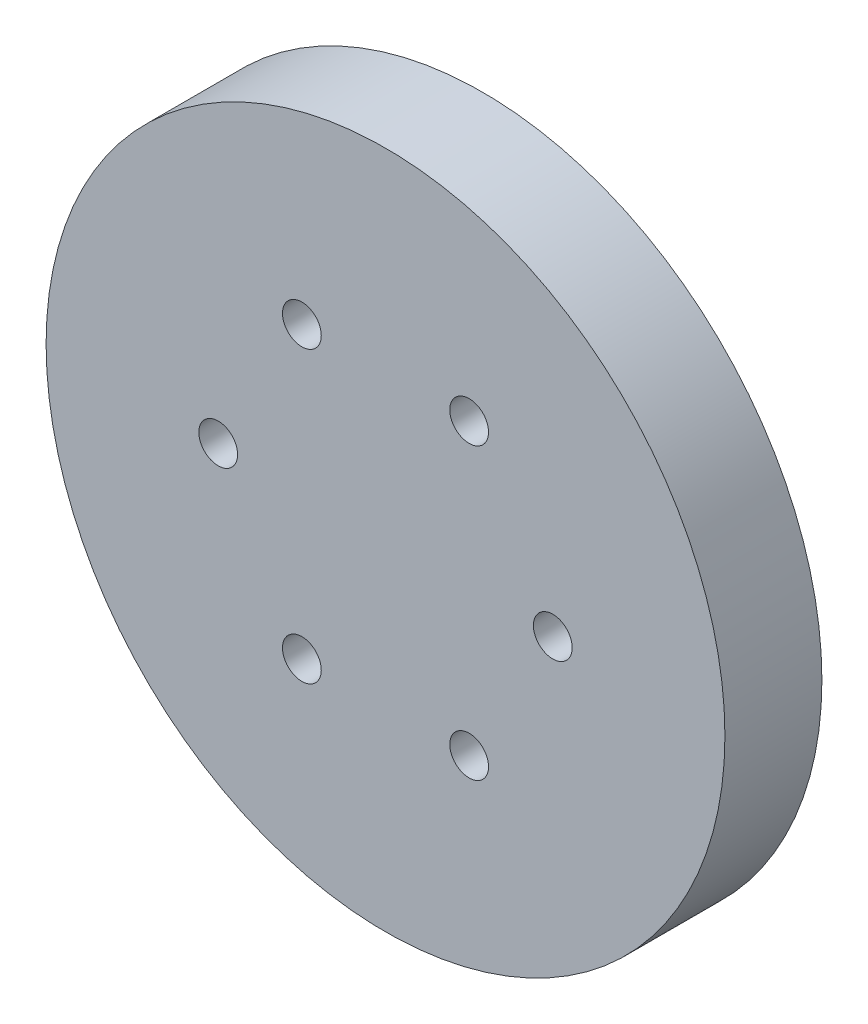
ISO-10303-21;
HEADER;
FILE_DESCRIPTION(('STEP AP214'),'2;1');
FILE_NAME('part.step','',(''),(''),'','','');
FILE_SCHEMA(('AUTOMOTIVE_DESIGN { 1 0 10303 214 1 1 1 1 }'));
ENDSEC;
DATA;
#1=APPLICATION_CONTEXT('core data for automotive mechanical design processes');
#2=APPLICATION_PROTOCOL_DEFINITION('international standard','automotive_design',2000,#1);
#3=PRODUCT_CONTEXT('',#1,'mechanical');
#4=PRODUCT('Part','Part','',(#3));
#5=PRODUCT_RELATED_PRODUCT_CATEGORY('part','',(#4));
#6=PRODUCT_DEFINITION_FORMATION('','',#4);
#7=PRODUCT_DEFINITION_CONTEXT('part definition',#1,'design');
#8=PRODUCT_DEFINITION('design','',#6,#7);
#9=PRODUCT_DEFINITION_SHAPE('','',#8);
#10=(LENGTH_UNIT() NAMED_UNIT(*) SI_UNIT(.MILLI.,.METRE.));
#11=(NAMED_UNIT(*) PLANE_ANGLE_UNIT() SI_UNIT($,.RADIAN.));
#12=(NAMED_UNIT(*) SI_UNIT($,.STERADIAN.) SOLID_ANGLE_UNIT());
#13=UNCERTAINTY_MEASURE_WITH_UNIT(LENGTH_MEASURE(1.E-05),#10,'distance_accuracy_value','');
#14=(GEOMETRIC_REPRESENTATION_CONTEXT(3) GLOBAL_UNCERTAINTY_ASSIGNED_CONTEXT((#13)) GLOBAL_UNIT_ASSIGNED_CONTEXT((#10,
#11,#12)) REPRESENTATION_CONTEXT('',''));
#15=CARTESIAN_POINT('',(0.,0.,0.));
#16=DIRECTION('',(0.,0.,1.));
#17=DIRECTION('',(1.,0.,0.));
#18=AXIS2_PLACEMENT_3D('',#15,#16,#17);
#19=CARTESIAN_POINT('',(8.62499999999986,-14.9389382152816,10.));
#20=DIRECTION('',(0.,0.,-1.));
#21=DIRECTION('',(-1.,0.,0.));
#22=AXIS2_PLACEMENT_3D('',#19,#20,#21);
#23=CYLINDRICAL_SURFACE('',#22,2.);
#24=CARTESIAN_POINT('',(8.62499999999986,-14.9389382152816,10.));
#25=DIRECTION('',(0.,0.,1.));
#26=DIRECTION('',(1.,0.,0.));
#27=AXIS2_PLACEMENT_3D('',#24,#25,#26);
#28=CIRCLE('',#27,2.);
#29=CARTESIAN_POINT('',(10.6249999999999,-14.9389382152816,10.));
#30=VERTEX_POINT('',#29);
#31=EDGE_CURVE('E47',#30,#30,#28,.T.);
#32=ORIENTED_EDGE('',*,*,#31,.T.);
#33=EDGE_LOOP('',(#32));
#34=FACE_BOUND('',#33,.T.);
#35=CARTESIAN_POINT('',(8.62499999999986,-14.9389382152816,0.));
#36=DIRECTION('',(0.,0.,1.));
#37=DIRECTION('',(1.,0.,0.));
#38=AXIS2_PLACEMENT_3D('',#35,#36,#37);
#39=CIRCLE('',#38,2.);
#40=CARTESIAN_POINT('',(10.6249999999999,-14.9389382152816,0.));
#41=VERTEX_POINT('',#40);
#42=EDGE_CURVE('E70',#41,#41,#39,.T.);
#43=ORIENTED_EDGE('',*,*,#42,.F.);
#44=EDGE_LOOP('',(#43));
#45=FACE_BOUND('',#44,.T.);
#46=ADVANCED_FACE('F39',(#34,#45),#23,.F.);
#47=CARTESIAN_POINT('',(17.25,-1.20456106190088E-13,10.));
#48=DIRECTION('',(0.,0.,-1.));
#49=DIRECTION('',(-1.,0.,0.));
#50=AXIS2_PLACEMENT_3D('',#47,#48,#49);
#51=CYLINDRICAL_SURFACE('',#50,2.);
#52=CARTESIAN_POINT('',(17.25,-1.20456106190088E-13,10.));
#53=DIRECTION('',(0.,0.,1.));
#54=DIRECTION('',(1.,0.,0.));
#55=AXIS2_PLACEMENT_3D('',#52,#53,#54);
#56=CIRCLE('',#55,2.);
#57=CARTESIAN_POINT('',(19.25,-1.20456106190088E-13,10.));
#58=VERTEX_POINT('',#57);
#59=EDGE_CURVE('E52',#58,#58,#56,.T.);
#60=ORIENTED_EDGE('',*,*,#59,.T.);
#61=EDGE_LOOP('',(#60));
#62=FACE_BOUND('',#61,.T.);
#63=CARTESIAN_POINT('',(17.25,-1.20456106190088E-13,0.));
#64=DIRECTION('',(0.,0.,1.));
#65=DIRECTION('',(1.,0.,0.));
#66=AXIS2_PLACEMENT_3D('',#63,#64,#65);
#67=CIRCLE('',#66,2.);
#68=CARTESIAN_POINT('',(19.25,-1.20456106190088E-13,0.));
#69=VERTEX_POINT('',#68);
#70=EDGE_CURVE('E68',#69,#69,#67,.T.);
#71=ORIENTED_EDGE('',*,*,#70,.F.);
#72=EDGE_LOOP('',(#71));
#73=FACE_BOUND('',#72,.T.);
#74=ADVANCED_FACE('F94',(#62,#73),#51,.F.);
#75=CARTESIAN_POINT('',(8.62500000000007,14.9389382152815,10.));
#76=DIRECTION('',(0.,0.,-1.));
#77=DIRECTION('',(-1.,0.,0.));
#78=AXIS2_PLACEMENT_3D('',#75,#76,#77);
#79=CYLINDRICAL_SURFACE('',#78,2.);
#80=CARTESIAN_POINT('',(8.62500000000007,14.9389382152815,10.));
#81=DIRECTION('',(0.,0.,1.));
#82=DIRECTION('',(1.,0.,0.));
#83=AXIS2_PLACEMENT_3D('',#80,#81,#82);
#84=CIRCLE('',#83,2.);
#85=CARTESIAN_POINT('',(10.6250000000001,14.9389382152815,10.));
#86=VERTEX_POINT('',#85);
#87=EDGE_CURVE('E89',#86,#86,#84,.T.);
#88=ORIENTED_EDGE('',*,*,#87,.T.);
#89=EDGE_LOOP('',(#88));
#90=FACE_BOUND('',#89,.T.);
#91=CARTESIAN_POINT('',(8.62500000000007,14.9389382152815,0.));
#92=DIRECTION('',(0.,0.,1.));
#93=DIRECTION('',(1.,0.,0.));
#94=AXIS2_PLACEMENT_3D('',#91,#92,#93);
#95=CIRCLE('',#94,2.);
#96=CARTESIAN_POINT('',(10.6250000000001,14.9389382152815,0.));
#97=VERTEX_POINT('',#96);
#98=EDGE_CURVE('E65',#97,#97,#95,.T.);
#99=ORIENTED_EDGE('',*,*,#98,.F.);
#100=EDGE_LOOP('',(#99));
#101=FACE_BOUND('',#100,.T.);
#102=ADVANCED_FACE('F112',(#90,#101),#79,.F.);
#103=CARTESIAN_POINT('',(-8.62499999999997,14.9389382152816,10.));
#104=DIRECTION('',(0.,0.,-1.));
#105=DIRECTION('',(-1.,0.,0.));
#106=AXIS2_PLACEMENT_3D('',#103,#104,#105);
#107=CYLINDRICAL_SURFACE('',#106,2.);
#108=CARTESIAN_POINT('',(-8.62499999999997,14.9389382152816,10.));
#109=DIRECTION('',(0.,0.,1.));
#110=DIRECTION('',(1.,0.,0.));
#111=AXIS2_PLACEMENT_3D('',#108,#109,#110);
#112=CIRCLE('',#111,2.);
#113=CARTESIAN_POINT('',(-6.62499999999997,14.9389382152816,10.));
#114=VERTEX_POINT('',#113);
#115=EDGE_CURVE('E84',#114,#114,#112,.T.);
#116=ORIENTED_EDGE('',*,*,#115,.T.);
#117=EDGE_LOOP('',(#116));
#118=FACE_BOUND('',#117,.T.);
#119=CARTESIAN_POINT('',(-8.62499999999997,14.9389382152816,0.));
#120=DIRECTION('',(0.,0.,1.));
#121=DIRECTION('',(1.,0.,0.));
#122=AXIS2_PLACEMENT_3D('',#119,#120,#121);
#123=CIRCLE('',#122,2.);
#124=CARTESIAN_POINT('',(-6.62499999999997,14.9389382152816,0.));
#125=VERTEX_POINT('',#124);
#126=EDGE_CURVE('E62',#125,#125,#123,.T.);
#127=ORIENTED_EDGE('',*,*,#126,.F.);
#128=EDGE_LOOP('',(#127));
#129=FACE_BOUND('',#128,.T.);
#130=ADVANCED_FACE('F119',(#118,#129),#107,.F.);
#131=CARTESIAN_POINT('',(-17.25,0.,10.));
#132=DIRECTION('',(0.,0.,-1.));
#133=DIRECTION('',(-1.,0.,0.));
#134=AXIS2_PLACEMENT_3D('',#131,#132,#133);
#135=CYLINDRICAL_SURFACE('',#134,2.);
#136=CARTESIAN_POINT('',(-17.25,0.,10.));
#137=DIRECTION('',(0.,0.,1.));
#138=DIRECTION('',(1.,0.,0.));
#139=AXIS2_PLACEMENT_3D('',#136,#137,#138);
#140=CIRCLE('',#139,2.);
#141=CARTESIAN_POINT('',(-15.25,0.,10.));
#142=VERTEX_POINT('',#141);
#143=EDGE_CURVE('E79',#142,#142,#140,.T.);
#144=ORIENTED_EDGE('',*,*,#143,.T.);
#145=EDGE_LOOP('',(#144));
#146=FACE_BOUND('',#145,.T.);
#147=CARTESIAN_POINT('',(-17.25,0.,0.));
#148=DIRECTION('',(0.,0.,1.));
#149=DIRECTION('',(1.,0.,0.));
#150=AXIS2_PLACEMENT_3D('',#147,#148,#149);
#151=CIRCLE('',#150,2.);
#152=CARTESIAN_POINT('',(-15.25,0.,0.));
#153=VERTEX_POINT('',#152);
#154=EDGE_CURVE('E59',#153,#153,#151,.T.);
#155=ORIENTED_EDGE('',*,*,#154,.F.);
#156=EDGE_LOOP('',(#155));
#157=FACE_BOUND('',#156,.T.);
#158=ADVANCED_FACE('F122',(#146,#157),#135,.F.);
#159=CARTESIAN_POINT('',(-8.62500000000018,-14.9389382152815,10.));
#160=DIRECTION('',(0.,0.,-1.));
#161=DIRECTION('',(-1.,0.,0.));
#162=AXIS2_PLACEMENT_3D('',#159,#160,#161);
#163=CYLINDRICAL_SURFACE('',#162,2.);
#164=CARTESIAN_POINT('',(-8.62500000000018,-14.9389382152815,10.));
#165=DIRECTION('',(0.,0.,1.));
#166=DIRECTION('',(1.,0.,0.));
#167=AXIS2_PLACEMENT_3D('',#164,#165,#166);
#168=CIRCLE('',#167,2.);
#169=CARTESIAN_POINT('',(-6.62500000000018,-14.9389382152815,10.));
#170=VERTEX_POINT('',#169);
#171=EDGE_CURVE('E75',#170,#170,#168,.T.);
#172=ORIENTED_EDGE('',*,*,#171,.T.);
#173=EDGE_LOOP('',(#172));
#174=FACE_BOUND('',#173,.T.);
#175=CARTESIAN_POINT('',(-8.62500000000018,-14.9389382152815,0.));
#176=DIRECTION('',(0.,0.,1.));
#177=DIRECTION('',(1.,0.,0.));
#178=AXIS2_PLACEMENT_3D('',#175,#176,#177);
#179=CIRCLE('',#178,2.);
#180=CARTESIAN_POINT('',(-6.62500000000018,-14.9389382152815,0.));
#181=VERTEX_POINT('',#180);
#182=EDGE_CURVE('E56',#181,#181,#179,.T.);
#183=ORIENTED_EDGE('',*,*,#182,.F.);
#184=EDGE_LOOP('',(#183));
#185=FACE_BOUND('',#184,.T.);
#186=ADVANCED_FACE('F41',(#174,#185),#163,.F.);
#187=CARTESIAN_POINT('',(0.,0.,10.));
#188=DIRECTION('',(0.,0.,-1.));
#189=DIRECTION('',(-1.,0.,0.));
#190=AXIS2_PLACEMENT_3D('',#187,#188,#189);
#191=CYLINDRICAL_SURFACE('',#190,35.);
#192=CARTESIAN_POINT('',(0.,0.,10.));
#193=DIRECTION('',(0.,0.,1.));
#194=DIRECTION('',(1.,0.,0.));
#195=AXIS2_PLACEMENT_3D('',#192,#193,#194);
#196=CIRCLE('',#195,35.);
#197=CARTESIAN_POINT('',(35.,0.,10.));
#198=VERTEX_POINT('',#197);
#199=EDGE_CURVE('E10',#198,#198,#196,.T.);
#200=ORIENTED_EDGE('',*,*,#199,.F.);
#201=EDGE_LOOP('',(#200));
#202=FACE_BOUND('',#201,.T.);
#203=CARTESIAN_POINT('',(0.,0.,0.));
#204=DIRECTION('',(0.,0.,1.));
#205=DIRECTION('',(1.,0.,0.));
#206=AXIS2_PLACEMENT_3D('',#203,#204,#205);
#207=CIRCLE('',#206,35.);
#208=CARTESIAN_POINT('',(35.,0.,0.));
#209=VERTEX_POINT('',#208);
#210=EDGE_CURVE('E43',#209,#209,#207,.T.);
#211=ORIENTED_EDGE('',*,*,#210,.T.);
#212=EDGE_LOOP('',(#211));
#213=FACE_BOUND('',#212,.T.);
#214=ADVANCED_FACE('F101',(#202,#213),#191,.T.);
#215=CARTESIAN_POINT('',(0.,0.,10.));
#216=DIRECTION('',(0.,0.,1.));
#217=DIRECTION('',(1.,0.,0.));
#218=AXIS2_PLACEMENT_3D('',#215,#216,#217);
#219=PLANE('',#218);
#220=ORIENTED_EDGE('',*,*,#171,.F.);
#221=EDGE_LOOP('',(#220));
#222=FACE_BOUND('',#221,.T.);
#223=ORIENTED_EDGE('',*,*,#143,.F.);
#224=EDGE_LOOP('',(#223));
#225=FACE_BOUND('',#224,.T.);
#226=ORIENTED_EDGE('',*,*,#115,.F.);
#227=EDGE_LOOP('',(#226));
#228=FACE_BOUND('',#227,.T.);
#229=ORIENTED_EDGE('',*,*,#87,.F.);
#230=EDGE_LOOP('',(#229));
#231=FACE_BOUND('',#230,.T.);
#232=ORIENTED_EDGE('',*,*,#59,.F.);
#233=EDGE_LOOP('',(#232));
#234=FACE_BOUND('',#233,.T.);
#235=ORIENTED_EDGE('',*,*,#31,.F.);
#236=EDGE_LOOP('',(#235));
#237=FACE_BOUND('',#236,.T.);
#238=ORIENTED_EDGE('',*,*,#199,.T.);
#239=EDGE_LOOP('',(#238));
#240=FACE_BOUND('',#239,.T.);
#241=ADVANCED_FACE('F97',(#222,#225,#228,#231,#234,#237,#240),#219,.T.);
#242=CARTESIAN_POINT('',(0.,0.,0.));
#243=DIRECTION('',(0.,0.,1.));
#244=DIRECTION('',(1.,0.,0.));
#245=AXIS2_PLACEMENT_3D('',#242,#243,#244);
#246=PLANE('',#245);
#247=ORIENTED_EDGE('',*,*,#182,.T.);
#248=EDGE_LOOP('',(#247));
#249=FACE_BOUND('',#248,.T.);
#250=ORIENTED_EDGE('',*,*,#154,.T.);
#251=EDGE_LOOP('',(#250));
#252=FACE_BOUND('',#251,.T.);
#253=ORIENTED_EDGE('',*,*,#126,.T.);
#254=EDGE_LOOP('',(#253));
#255=FACE_BOUND('',#254,.T.);
#256=ORIENTED_EDGE('',*,*,#98,.T.);
#257=EDGE_LOOP('',(#256));
#258=FACE_BOUND('',#257,.T.);
#259=ORIENTED_EDGE('',*,*,#70,.T.);
#260=EDGE_LOOP('',(#259));
#261=FACE_BOUND('',#260,.T.);
#262=ORIENTED_EDGE('',*,*,#42,.T.);
#263=EDGE_LOOP('',(#262));
#264=FACE_BOUND('',#263,.T.);
#265=ORIENTED_EDGE('',*,*,#210,.F.);
#266=EDGE_LOOP('',(#265));
#267=FACE_BOUND('',#266,.T.);
#268=ADVANCED_FACE('F100',(#249,#252,#255,#258,#261,#264,#267),#246,.F.);
#269=CLOSED_SHELL('',(#46,#74,#102,#130,#158,#186,#214,#241,#268));
#270=MANIFOLD_SOLID_BREP('B2',#269);
#271=ADVANCED_BREP_SHAPE_REPRESENTATION('',(#18,#270),#14);
#272=SHAPE_DEFINITION_REPRESENTATION(#9,#271);
ENDSEC;
END-ISO-10303-21;
